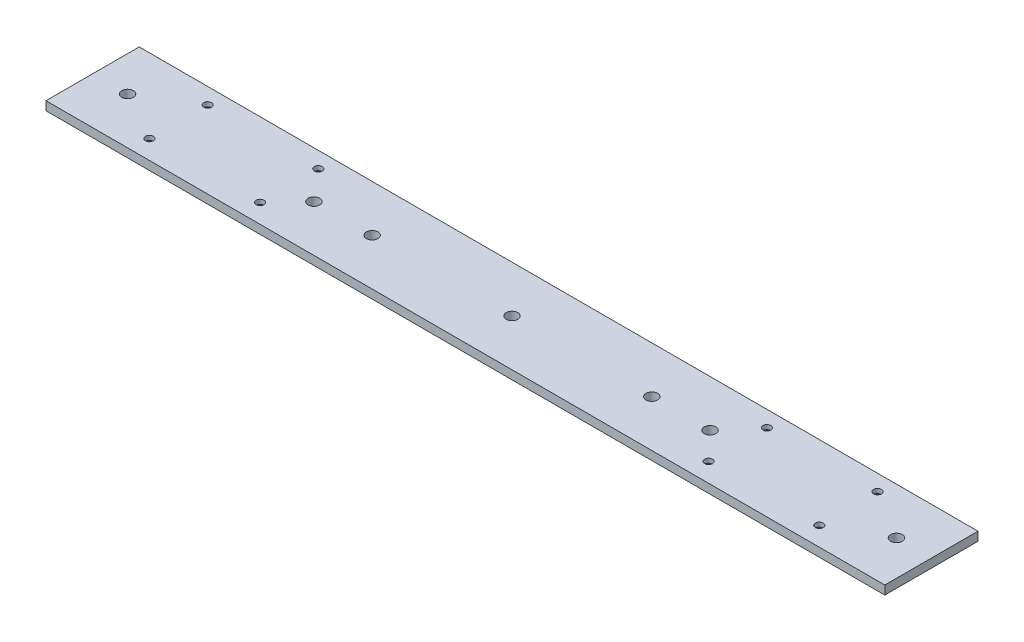
ISO-10303-21;
HEADER;
FILE_DESCRIPTION(('STEP AP214'),'2;1');
FILE_NAME('part.step','',(''),(''),'','','');
FILE_SCHEMA(('AUTOMOTIVE_DESIGN { 1 0 10303 214 1 1 1 1 }'));
ENDSEC;
DATA;
#1=APPLICATION_CONTEXT('core data for automotive mechanical design processes');
#2=APPLICATION_PROTOCOL_DEFINITION('international standard','automotive_design',2000,#1);
#3=PRODUCT_CONTEXT('',#1,'mechanical');
#4=PRODUCT('Part','Part','',(#3));
#5=PRODUCT_RELATED_PRODUCT_CATEGORY('part','',(#4));
#6=PRODUCT_DEFINITION_FORMATION('','',#4);
#7=PRODUCT_DEFINITION_CONTEXT('part definition',#1,'design');
#8=PRODUCT_DEFINITION('design','',#6,#7);
#9=PRODUCT_DEFINITION_SHAPE('','',#8);
#10=(LENGTH_UNIT() NAMED_UNIT(*) SI_UNIT(.MILLI.,.METRE.));
#11=(NAMED_UNIT(*) PLANE_ANGLE_UNIT() SI_UNIT($,.RADIAN.));
#12=(NAMED_UNIT(*) SI_UNIT($,.STERADIAN.) SOLID_ANGLE_UNIT());
#13=UNCERTAINTY_MEASURE_WITH_UNIT(LENGTH_MEASURE(1.E-05),#10,'distance_accuracy_value','');
#14=(GEOMETRIC_REPRESENTATION_CONTEXT(3) GLOBAL_UNCERTAINTY_ASSIGNED_CONTEXT((#13)) GLOBAL_UNIT_ASSIGNED_CONTEXT((#10,
#11,#12)) REPRESENTATION_CONTEXT('',''));
#15=CARTESIAN_POINT('',(0.,0.,0.));
#16=DIRECTION('',(0.,0.,1.));
#17=DIRECTION('',(1.,0.,0.));
#18=AXIS2_PLACEMENT_3D('',#15,#16,#17);
#19=CARTESIAN_POINT('',(0.,4.7625,0.));
#20=DIRECTION('',(1.,0.,0.));
#21=DIRECTION('',(0.,0.,-1.));
#22=AXIS2_PLACEMENT_3D('',#19,#20,#21);
#23=PLANE('',#22);
#24=DIRECTION('',(0.,0.,1.));
#25=VECTOR('',#24,1.);
#26=CARTESIAN_POINT('',(0.,0.,0.));
#27=LINE('',#26,#25);
#28=CARTESIAN_POINT('',(0.,0.,-50.8));
#29=VERTEX_POINT('',#28);
#30=CARTESIAN_POINT('',(0.,0.,0.));
#31=VERTEX_POINT('',#30);
#32=EDGE_CURVE('E101',#29,#31,#27,.T.);
#33=ORIENTED_EDGE('',*,*,#32,.T.);
#34=DIRECTION('',(0.,-1.,0.));
#35=VECTOR('',#34,1.);
#36=CARTESIAN_POINT('',(0.,4.7625,0.));
#37=LINE('',#36,#35);
#38=CARTESIAN_POINT('',(0.,4.7625,0.));
#39=VERTEX_POINT('',#38);
#40=EDGE_CURVE('E11',#39,#31,#37,.T.);
#41=ORIENTED_EDGE('',*,*,#40,.F.);
#42=DIRECTION('',(0.,0.,1.));
#43=VECTOR('',#42,1.);
#44=CARTESIAN_POINT('',(0.,4.7625,0.));
#45=LINE('',#44,#43);
#46=CARTESIAN_POINT('',(0.,4.7625,-50.8));
#47=VERTEX_POINT('',#46);
#48=EDGE_CURVE('E87',#47,#39,#45,.T.);
#49=ORIENTED_EDGE('',*,*,#48,.F.);
#50=DIRECTION('',(0.,-1.,0.));
#51=VECTOR('',#50,1.);
#52=CARTESIAN_POINT('',(0.,4.7625,-50.8));
#53=LINE('',#52,#51);
#54=EDGE_CURVE('E97',#47,#29,#53,.T.);
#55=ORIENTED_EDGE('',*,*,#54,.T.);
#56=EDGE_LOOP('',(#33,#41,#49,#55));
#57=FACE_BOUND('',#56,.T.);
#58=ADVANCED_FACE('F34',(#57),#23,.F.);
#59=CARTESIAN_POINT('',(0.,4.7625,0.));
#60=DIRECTION('',(0.,0.,-1.));
#61=DIRECTION('',(-1.,0.,0.));
#62=AXIS2_PLACEMENT_3D('',#59,#60,#61);
#63=PLANE('',#62);
#64=DIRECTION('',(1.,0.,0.));
#65=VECTOR('',#64,1.);
#66=CARTESIAN_POINT('',(0.,0.,0.));
#67=LINE('',#66,#65);
#68=CARTESIAN_POINT('',(457.2,0.,0.));
#69=VERTEX_POINT('',#68);
#70=EDGE_CURVE('E91',#31,#69,#67,.T.);
#71=ORIENTED_EDGE('',*,*,#70,.T.);
#72=DIRECTION('',(0.,-1.,0.));
#73=VECTOR('',#72,1.);
#74=CARTESIAN_POINT('',(457.2,4.7625,0.));
#75=LINE('',#74,#73);
#76=CARTESIAN_POINT('',(457.2,4.7625,0.));
#77=VERTEX_POINT('',#76);
#78=EDGE_CURVE('E43',#77,#69,#75,.T.);
#79=ORIENTED_EDGE('',*,*,#78,.F.);
#80=DIRECTION('',(1.,0.,0.));
#81=VECTOR('',#80,1.);
#82=CARTESIAN_POINT('',(0.,4.7625,0.));
#83=LINE('',#82,#81);
#84=EDGE_CURVE('E82',#39,#77,#83,.T.);
#85=ORIENTED_EDGE('',*,*,#84,.F.);
#86=ORIENTED_EDGE('',*,*,#40,.T.);
#87=EDGE_LOOP('',(#71,#79,#85,#86));
#88=FACE_BOUND('',#87,.T.);
#89=ADVANCED_FACE('F90',(#88),#63,.F.);
#90=CARTESIAN_POINT('',(457.2,4.7625,0.));
#91=DIRECTION('',(-1.,0.,0.));
#92=DIRECTION('',(0.,0.,1.));
#93=AXIS2_PLACEMENT_3D('',#90,#91,#92);
#94=PLANE('',#93);
#95=DIRECTION('',(0.,0.,-1.));
#96=VECTOR('',#95,1.);
#97=CARTESIAN_POINT('',(457.2,0.,0.));
#98=LINE('',#97,#96);
#99=CARTESIAN_POINT('',(457.2,0.,-50.8));
#100=VERTEX_POINT('',#99);
#101=EDGE_CURVE('E69',#69,#100,#98,.T.);
#102=ORIENTED_EDGE('',*,*,#101,.T.);
#103=DIRECTION('',(0.,-1.,0.));
#104=VECTOR('',#103,1.);
#105=CARTESIAN_POINT('',(457.2,4.7625,-50.8));
#106=LINE('',#105,#104);
#107=CARTESIAN_POINT('',(457.2,4.7625,-50.8));
#108=VERTEX_POINT('',#107);
#109=EDGE_CURVE('E92',#108,#100,#106,.T.);
#110=ORIENTED_EDGE('',*,*,#109,.F.);
#111=DIRECTION('',(0.,0.,-1.));
#112=VECTOR('',#111,1.);
#113=CARTESIAN_POINT('',(457.2,4.7625,0.));
#114=LINE('',#113,#112);
#115=EDGE_CURVE('E85',#77,#108,#114,.T.);
#116=ORIENTED_EDGE('',*,*,#115,.F.);
#117=ORIENTED_EDGE('',*,*,#78,.T.);
#118=EDGE_LOOP('',(#102,#110,#116,#117));
#119=FACE_BOUND('',#118,.T.);
#120=ADVANCED_FACE('F94',(#119),#94,.F.);
#121=CARTESIAN_POINT('',(0.,4.7625,-50.8));
#122=DIRECTION('',(0.,0.,1.));
#123=DIRECTION('',(1.,0.,0.));
#124=AXIS2_PLACEMENT_3D('',#121,#122,#123);
#125=PLANE('',#124);
#126=DIRECTION('',(-1.,0.,0.));
#127=VECTOR('',#126,1.);
#128=CARTESIAN_POINT('',(0.,0.,-50.8));
#129=LINE('',#128,#127);
#130=EDGE_CURVE('E75',#100,#29,#129,.T.);
#131=ORIENTED_EDGE('',*,*,#130,.T.);
#132=ORIENTED_EDGE('',*,*,#54,.F.);
#133=DIRECTION('',(-1.,0.,0.));
#134=VECTOR('',#133,1.);
#135=CARTESIAN_POINT('',(0.,4.7625,-50.8));
#136=LINE('',#135,#134);
#137=EDGE_CURVE('E52',#108,#47,#136,.T.);
#138=ORIENTED_EDGE('',*,*,#137,.F.);
#139=ORIENTED_EDGE('',*,*,#109,.T.);
#140=EDGE_LOOP('',(#131,#132,#138,#139));
#141=FACE_BOUND('',#140,.T.);
#142=ADVANCED_FACE('F162',(#141),#125,.F.);
#143=CARTESIAN_POINT('',(0.,4.7625,0.));
#144=DIRECTION('',(0.,-1.,0.));
#145=DIRECTION('',(0.,0.,-1.));
#146=AXIS2_PLACEMENT_3D('',#143,#144,#145);
#147=PLANE('',#146);
#148=CARTESIAN_POINT('',(46.0375,4.7625,-42.06875));
#149=DIRECTION('',(0.,-1.,0.));
#150=DIRECTION('',(0.,0.,-1.));
#151=AXIS2_PLACEMENT_3D('',#148,#149,#150);
#152=CIRCLE('',#151,2.15265);
#153=CARTESIAN_POINT('',(46.0375,4.7625,-44.2214));
#154=VERTEX_POINT('',#153);
#155=EDGE_CURVE('E441',#154,#154,#152,.T.);
#156=ORIENTED_EDGE('',*,*,#155,.T.);
#157=EDGE_LOOP('',(#156));
#158=FACE_BOUND('',#157,.T.);
#159=CARTESIAN_POINT('',(46.0375,4.7625,-10.31875));
#160=DIRECTION('',(0.,-1.,0.));
#161=DIRECTION('',(0.,0.,-1.));
#162=AXIS2_PLACEMENT_3D('',#159,#160,#161);
#163=CIRCLE('',#162,2.15265);
#164=CARTESIAN_POINT('',(46.0375,4.7625,-12.4714));
#165=VERTEX_POINT('',#164);
#166=EDGE_CURVE('E451',#165,#165,#163,.T.);
#167=ORIENTED_EDGE('',*,*,#166,.T.);
#168=EDGE_LOOP('',(#167));
#169=FACE_BOUND('',#168,.T.);
#170=CARTESIAN_POINT('',(106.3625,4.7625,-10.31875));
#171=DIRECTION('',(0.,-1.,0.));
#172=DIRECTION('',(0.,0.,-1.));
#173=AXIS2_PLACEMENT_3D('',#170,#171,#172);
#174=CIRCLE('',#173,2.15265000000001);
#175=CARTESIAN_POINT('',(106.3625,4.7625,-12.4714));
#176=VERTEX_POINT('',#175);
#177=EDGE_CURVE('E460',#176,#176,#174,.T.);
#178=ORIENTED_EDGE('',*,*,#177,.T.);
#179=EDGE_LOOP('',(#178));
#180=FACE_BOUND('',#179,.T.);
#181=CARTESIAN_POINT('',(106.3625,4.7625,-42.06875));
#182=DIRECTION('',(0.,-1.,0.));
#183=DIRECTION('',(0.,0.,-1.));
#184=AXIS2_PLACEMENT_3D('',#181,#182,#183);
#185=CIRCLE('',#184,2.15264999999999);
#186=CARTESIAN_POINT('',(106.3625,4.7625,-44.2214));
#187=VERTEX_POINT('',#186);
#188=EDGE_CURVE('E469',#187,#187,#185,.T.);
#189=ORIENTED_EDGE('',*,*,#188,.T.);
#190=EDGE_LOOP('',(#189));
#191=FACE_BOUND('',#190,.T.);
#192=CARTESIAN_POINT('',(350.8375,4.7625,-42.06875));
#193=DIRECTION('',(0.,-1.,0.));
#194=DIRECTION('',(0.,0.,-1.));
#195=AXIS2_PLACEMENT_3D('',#192,#193,#194);
#196=CIRCLE('',#195,2.15264999999998);
#197=CARTESIAN_POINT('',(350.8375,4.7625,-44.2214));
#198=VERTEX_POINT('',#197);
#199=EDGE_CURVE('E478',#198,#198,#196,.T.);
#200=ORIENTED_EDGE('',*,*,#199,.T.);
#201=EDGE_LOOP('',(#200));
#202=FACE_BOUND('',#201,.T.);
#203=CARTESIAN_POINT('',(350.8375,4.7625,-10.31875));
#204=DIRECTION('',(0.,-1.,0.));
#205=DIRECTION('',(0.,0.,-1.));
#206=AXIS2_PLACEMENT_3D('',#203,#204,#205);
#207=CIRCLE('',#206,2.15264999999998);
#208=CARTESIAN_POINT('',(350.8375,4.7625,-12.4714));
#209=VERTEX_POINT('',#208);
#210=EDGE_CURVE('E487',#209,#209,#207,.T.);
#211=ORIENTED_EDGE('',*,*,#210,.T.);
#212=EDGE_LOOP('',(#211));
#213=FACE_BOUND('',#212,.T.);
#214=CARTESIAN_POINT('',(411.1625,4.7625,-10.31875));
#215=DIRECTION('',(0.,-1.,0.));
#216=DIRECTION('',(0.,0.,-1.));
#217=AXIS2_PLACEMENT_3D('',#214,#215,#216);
#218=CIRCLE('',#217,2.15264999999998);
#219=CARTESIAN_POINT('',(411.1625,4.7625,-12.4714));
#220=VERTEX_POINT('',#219);
#221=EDGE_CURVE('E496',#220,#220,#218,.T.);
#222=ORIENTED_EDGE('',*,*,#221,.T.);
#223=EDGE_LOOP('',(#222));
#224=FACE_BOUND('',#223,.T.);
#225=CARTESIAN_POINT('',(411.1625,4.7625,-42.06875));
#226=DIRECTION('',(0.,-1.,0.));
#227=DIRECTION('',(0.,0.,-1.));
#228=AXIS2_PLACEMENT_3D('',#225,#226,#227);
#229=CIRCLE('',#228,2.15264999999998);
#230=CARTESIAN_POINT('',(411.1625,4.7625,-44.2214));
#231=VERTEX_POINT('',#230);
#232=EDGE_CURVE('E506',#231,#231,#229,.T.);
#233=ORIENTED_EDGE('',*,*,#232,.T.);
#234=EDGE_LOOP('',(#233));
#235=FACE_BOUND('',#234,.T.);
#236=CARTESIAN_POINT('',(336.55,4.7625,-25.4));
#237=DIRECTION('',(0.,1.,0.));
#238=DIRECTION('',(0.,0.,1.));
#239=AXIS2_PLACEMENT_3D('',#236,#237,#238);
#240=CIRCLE('',#239,3.17499999999997);
#241=CARTESIAN_POINT('',(336.55,4.7625,-22.225));
#242=VERTEX_POINT('',#241);
#243=EDGE_CURVE('E144',#242,#242,#240,.T.);
#244=ORIENTED_EDGE('',*,*,#243,.F.);
#245=EDGE_LOOP('',(#244));
#246=FACE_BOUND('',#245,.T.);
#247=CARTESIAN_POINT('',(120.65,4.7625,-25.4));
#248=DIRECTION('',(0.,1.,0.));
#249=DIRECTION('',(0.,0.,1.));
#250=AXIS2_PLACEMENT_3D('',#247,#248,#249);
#251=CIRCLE('',#250,3.175);
#252=CARTESIAN_POINT('',(120.65,4.7625,-22.225));
#253=VERTEX_POINT('',#252);
#254=EDGE_CURVE('E134',#253,#253,#251,.T.);
#255=ORIENTED_EDGE('',*,*,#254,.F.);
#256=EDGE_LOOP('',(#255));
#257=FACE_BOUND('',#256,.T.);
#258=CARTESIAN_POINT('',(228.6,4.7625,-25.4));
#259=DIRECTION('',(0.,1.,0.));
#260=DIRECTION('',(0.,0.,1.));
#261=AXIS2_PLACEMENT_3D('',#258,#259,#260);
#262=CIRCLE('',#261,3.175);
#263=CARTESIAN_POINT('',(228.6,4.7625,-22.225));
#264=VERTEX_POINT('',#263);
#265=EDGE_CURVE('E131',#264,#264,#262,.T.);
#266=ORIENTED_EDGE('',*,*,#265,.F.);
#267=EDGE_LOOP('',(#266));
#268=FACE_BOUND('',#267,.T.);
#269=CARTESIAN_POINT('',(304.8,4.7625,-25.4));
#270=DIRECTION('',(0.,1.,0.));
#271=DIRECTION('',(0.,0.,1.));
#272=AXIS2_PLACEMENT_3D('',#269,#270,#271);
#273=CIRCLE('',#272,3.17499999999997);
#274=CARTESIAN_POINT('',(304.8,4.7625,-22.225));
#275=VERTEX_POINT('',#274);
#276=EDGE_CURVE('E127',#275,#275,#273,.T.);
#277=ORIENTED_EDGE('',*,*,#276,.F.);
#278=EDGE_LOOP('',(#277));
#279=FACE_BOUND('',#278,.T.);
#280=CARTESIAN_POINT('',(152.4,4.7625,-25.4));
#281=DIRECTION('',(0.,1.,0.));
#282=DIRECTION('',(0.,0.,1.));
#283=AXIS2_PLACEMENT_3D('',#280,#281,#282);
#284=CIRCLE('',#283,3.17499999999997);
#285=CARTESIAN_POINT('',(152.4,4.7625,-22.225));
#286=VERTEX_POINT('',#285);
#287=EDGE_CURVE('E123',#286,#286,#284,.T.);
#288=ORIENTED_EDGE('',*,*,#287,.F.);
#289=EDGE_LOOP('',(#288));
#290=FACE_BOUND('',#289,.T.);
#291=CARTESIAN_POINT('',(438.15,4.7625,-25.4));
#292=DIRECTION('',(0.,1.,0.));
#293=DIRECTION('',(0.,0.,1.));
#294=AXIS2_PLACEMENT_3D('',#291,#292,#293);
#295=CIRCLE('',#294,3.17499999999997);
#296=CARTESIAN_POINT('',(438.15,4.7625,-22.225));
#297=VERTEX_POINT('',#296);
#298=EDGE_CURVE('E118',#297,#297,#295,.T.);
#299=ORIENTED_EDGE('',*,*,#298,.F.);
#300=EDGE_LOOP('',(#299));
#301=FACE_BOUND('',#300,.T.);
#302=CARTESIAN_POINT('',(19.05,4.7625,-25.4));
#303=DIRECTION('',(0.,1.,0.));
#304=DIRECTION('',(0.,0.,1.));
#305=AXIS2_PLACEMENT_3D('',#302,#303,#304);
#306=CIRCLE('',#305,3.175);
#307=CARTESIAN_POINT('',(19.05,4.7625,-22.225));
#308=VERTEX_POINT('',#307);
#309=EDGE_CURVE('E114',#308,#308,#306,.T.);
#310=ORIENTED_EDGE('',*,*,#309,.F.);
#311=EDGE_LOOP('',(#310));
#312=FACE_BOUND('',#311,.T.);
#313=ORIENTED_EDGE('',*,*,#48,.T.);
#314=ORIENTED_EDGE('',*,*,#84,.T.);
#315=ORIENTED_EDGE('',*,*,#115,.T.);
#316=ORIENTED_EDGE('',*,*,#137,.T.);
#317=EDGE_LOOP('',(#313,#314,#315,#316));
#318=FACE_BOUND('',#317,.T.);
#319=ADVANCED_FACE('F83',(#158,#169,#180,#191,#202,#213,#224,#235,#246,#257,#268,#279,#290,#301,
#312,#318),#147,.F.);
#320=CARTESIAN_POINT('',(0.,0.,0.));
#321=DIRECTION('',(0.,-1.,0.));
#322=DIRECTION('',(0.,0.,-1.));
#323=AXIS2_PLACEMENT_3D('',#320,#321,#322);
#324=PLANE('',#323);
#325=CARTESIAN_POINT('',(46.0375,0.,-42.06875));
#326=DIRECTION('',(0.,-1.,0.));
#327=DIRECTION('',(0.,0.,-1.));
#328=AXIS2_PLACEMENT_3D('',#325,#326,#327);
#329=CIRCLE('',#328,4.2164);
#330=CARTESIAN_POINT('',(46.0375,0.,-46.28515));
#331=VERTEX_POINT('',#330);
#332=EDGE_CURVE('E439',#331,#331,#329,.T.);
#333=ORIENTED_EDGE('',*,*,#332,.F.);
#334=EDGE_LOOP('',(#333));
#335=FACE_BOUND('',#334,.T.);
#336=CARTESIAN_POINT('',(46.0375,0.,-10.31875));
#337=DIRECTION('',(0.,-1.,0.));
#338=DIRECTION('',(0.,0.,-1.));
#339=AXIS2_PLACEMENT_3D('',#336,#337,#338);
#340=CIRCLE('',#339,4.2164);
#341=CARTESIAN_POINT('',(46.0375,0.,-14.53515));
#342=VERTEX_POINT('',#341);
#343=EDGE_CURVE('E445',#342,#342,#340,.T.);
#344=ORIENTED_EDGE('',*,*,#343,.F.);
#345=EDGE_LOOP('',(#344));
#346=FACE_BOUND('',#345,.T.);
#347=CARTESIAN_POINT('',(106.3625,0.,-10.31875));
#348=DIRECTION('',(0.,-1.,0.));
#349=DIRECTION('',(0.,0.,-1.));
#350=AXIS2_PLACEMENT_3D('',#347,#348,#349);
#351=CIRCLE('',#350,4.21639999999999);
#352=CARTESIAN_POINT('',(106.3625,0.,-14.53515));
#353=VERTEX_POINT('',#352);
#354=EDGE_CURVE('E454',#353,#353,#351,.T.);
#355=ORIENTED_EDGE('',*,*,#354,.F.);
#356=EDGE_LOOP('',(#355));
#357=FACE_BOUND('',#356,.T.);
#358=CARTESIAN_POINT('',(106.3625,0.,-42.06875));
#359=DIRECTION('',(0.,-1.,0.));
#360=DIRECTION('',(0.,0.,-1.));
#361=AXIS2_PLACEMENT_3D('',#358,#359,#360);
#362=CIRCLE('',#361,4.21639999999999);
#363=CARTESIAN_POINT('',(106.3625,0.,-46.28515));
#364=VERTEX_POINT('',#363);
#365=EDGE_CURVE('E463',#364,#364,#362,.T.);
#366=ORIENTED_EDGE('',*,*,#365,.F.);
#367=EDGE_LOOP('',(#366));
#368=FACE_BOUND('',#367,.T.);
#369=CARTESIAN_POINT('',(350.8375,0.,-42.06875));
#370=DIRECTION('',(0.,-1.,0.));
#371=DIRECTION('',(0.,0.,-1.));
#372=AXIS2_PLACEMENT_3D('',#369,#370,#371);
#373=CIRCLE('',#372,4.21640000000001);
#374=CARTESIAN_POINT('',(350.8375,0.,-46.28515));
#375=VERTEX_POINT('',#374);
#376=EDGE_CURVE('E472',#375,#375,#373,.T.);
#377=ORIENTED_EDGE('',*,*,#376,.F.);
#378=EDGE_LOOP('',(#377));
#379=FACE_BOUND('',#378,.T.);
#380=CARTESIAN_POINT('',(350.8375,0.,-10.31875));
#381=DIRECTION('',(0.,-1.,0.));
#382=DIRECTION('',(0.,0.,-1.));
#383=AXIS2_PLACEMENT_3D('',#380,#381,#382);
#384=CIRCLE('',#383,4.21640000000001);
#385=CARTESIAN_POINT('',(350.8375,0.,-14.53515));
#386=VERTEX_POINT('',#385);
#387=EDGE_CURVE('E481',#386,#386,#384,.T.);
#388=ORIENTED_EDGE('',*,*,#387,.F.);
#389=EDGE_LOOP('',(#388));
#390=FACE_BOUND('',#389,.T.);
#391=CARTESIAN_POINT('',(411.1625,0.,-10.31875));
#392=DIRECTION('',(0.,-1.,0.));
#393=DIRECTION('',(0.,0.,-1.));
#394=AXIS2_PLACEMENT_3D('',#391,#392,#393);
#395=CIRCLE('',#394,4.21640000000001);
#396=CARTESIAN_POINT('',(411.1625,0.,-14.53515));
#397=VERTEX_POINT('',#396);
#398=EDGE_CURVE('E490',#397,#397,#395,.T.);
#399=ORIENTED_EDGE('',*,*,#398,.F.);
#400=EDGE_LOOP('',(#399));
#401=FACE_BOUND('',#400,.T.);
#402=CARTESIAN_POINT('',(411.1625,0.,-42.06875));
#403=DIRECTION('',(0.,-1.,0.));
#404=DIRECTION('',(0.,0.,-1.));
#405=AXIS2_PLACEMENT_3D('',#402,#403,#404);
#406=CIRCLE('',#405,4.21640000000001);
#407=CARTESIAN_POINT('',(411.1625,0.,-46.28515));
#408=VERTEX_POINT('',#407);
#409=EDGE_CURVE('E499',#408,#408,#406,.T.);
#410=ORIENTED_EDGE('',*,*,#409,.F.);
#411=EDGE_LOOP('',(#410));
#412=FACE_BOUND('',#411,.T.);
#413=CARTESIAN_POINT('',(336.55,0.,-25.4));
#414=DIRECTION('',(0.,-1.,0.));
#415=DIRECTION('',(0.,0.,-1.));
#416=AXIS2_PLACEMENT_3D('',#413,#414,#415);
#417=CIRCLE('',#416,3.17499999999997);
#418=CARTESIAN_POINT('',(336.55,0.,-28.575));
#419=VERTEX_POINT('',#418);
#420=EDGE_CURVE('E37',#419,#419,#417,.T.);
#421=ORIENTED_EDGE('',*,*,#420,.F.);
#422=EDGE_LOOP('',(#421));
#423=FACE_BOUND('',#422,.T.);
#424=CARTESIAN_POINT('',(120.65,0.,-25.4));
#425=DIRECTION('',(0.,-1.,0.));
#426=DIRECTION('',(0.,0.,-1.));
#427=AXIS2_PLACEMENT_3D('',#424,#425,#426);
#428=CIRCLE('',#427,3.175);
#429=CARTESIAN_POINT('',(120.65,0.,-28.575));
#430=VERTEX_POINT('',#429);
#431=EDGE_CURVE('E132',#430,#430,#428,.T.);
#432=ORIENTED_EDGE('',*,*,#431,.F.);
#433=EDGE_LOOP('',(#432));
#434=FACE_BOUND('',#433,.T.);
#435=CARTESIAN_POINT('',(228.6,0.,-25.4));
#436=DIRECTION('',(0.,-1.,0.));
#437=DIRECTION('',(0.,0.,-1.));
#438=AXIS2_PLACEMENT_3D('',#435,#436,#437);
#439=CIRCLE('',#438,3.175);
#440=CARTESIAN_POINT('',(228.6,0.,-28.575));
#441=VERTEX_POINT('',#440);
#442=EDGE_CURVE('E128',#441,#441,#439,.T.);
#443=ORIENTED_EDGE('',*,*,#442,.F.);
#444=EDGE_LOOP('',(#443));
#445=FACE_BOUND('',#444,.T.);
#446=CARTESIAN_POINT('',(304.8,0.,-25.4));
#447=DIRECTION('',(0.,-1.,0.));
#448=DIRECTION('',(0.,0.,-1.));
#449=AXIS2_PLACEMENT_3D('',#446,#447,#448);
#450=CIRCLE('',#449,3.17499999999997);
#451=CARTESIAN_POINT('',(304.8,0.,-28.575));
#452=VERTEX_POINT('',#451);
#453=EDGE_CURVE('E124',#452,#452,#450,.T.);
#454=ORIENTED_EDGE('',*,*,#453,.F.);
#455=EDGE_LOOP('',(#454));
#456=FACE_BOUND('',#455,.T.);
#457=CARTESIAN_POINT('',(152.4,0.,-25.4));
#458=DIRECTION('',(0.,-1.,0.));
#459=DIRECTION('',(0.,0.,-1.));
#460=AXIS2_PLACEMENT_3D('',#457,#458,#459);
#461=CIRCLE('',#460,3.17499999999997);
#462=CARTESIAN_POINT('',(152.4,0.,-28.575));
#463=VERTEX_POINT('',#462);
#464=EDGE_CURVE('E119',#463,#463,#461,.T.);
#465=ORIENTED_EDGE('',*,*,#464,.F.);
#466=EDGE_LOOP('',(#465));
#467=FACE_BOUND('',#466,.T.);
#468=CARTESIAN_POINT('',(438.15,0.,-25.4));
#469=DIRECTION('',(0.,-1.,0.));
#470=DIRECTION('',(0.,0.,-1.));
#471=AXIS2_PLACEMENT_3D('',#468,#469,#470);
#472=CIRCLE('',#471,3.17499999999997);
#473=CARTESIAN_POINT('',(438.15,0.,-28.575));
#474=VERTEX_POINT('',#473);
#475=EDGE_CURVE('E115',#474,#474,#472,.T.);
#476=ORIENTED_EDGE('',*,*,#475,.F.);
#477=EDGE_LOOP('',(#476));
#478=FACE_BOUND('',#477,.T.);
#479=CARTESIAN_POINT('',(19.05,0.,-25.4));
#480=DIRECTION('',(0.,-1.,0.));
#481=DIRECTION('',(0.,0.,-1.));
#482=AXIS2_PLACEMENT_3D('',#479,#480,#481);
#483=CIRCLE('',#482,3.175);
#484=CARTESIAN_POINT('',(19.05,0.,-28.575));
#485=VERTEX_POINT('',#484);
#486=EDGE_CURVE('E104',#485,#485,#483,.T.);
#487=ORIENTED_EDGE('',*,*,#486,.F.);
#488=EDGE_LOOP('',(#487));
#489=FACE_BOUND('',#488,.T.);
#490=ORIENTED_EDGE('',*,*,#32,.F.);
#491=ORIENTED_EDGE('',*,*,#130,.F.);
#492=ORIENTED_EDGE('',*,*,#101,.F.);
#493=ORIENTED_EDGE('',*,*,#70,.F.);
#494=EDGE_LOOP('',(#490,#491,#492,#493));
#495=FACE_BOUND('',#494,.T.);
#496=ADVANCED_FACE('F161',(#335,#346,#357,#368,#379,#390,#401,#412,#423,#434,#445,#456,#467,
#478,#489,#495),#324,.T.);
#497=CARTESIAN_POINT('',(19.05,-239.8395,-25.4));
#498=DIRECTION('',(0.,1.,0.));
#499=DIRECTION('',(0.,0.,1.));
#500=AXIS2_PLACEMENT_3D('',#497,#498,#499);
#501=CYLINDRICAL_SURFACE('',#500,3.175);
#502=ORIENTED_EDGE('',*,*,#486,.T.);
#503=EDGE_LOOP('',(#502));
#504=FACE_BOUND('',#503,.T.);
#505=ORIENTED_EDGE('',*,*,#309,.T.);
#506=EDGE_LOOP('',(#505));
#507=FACE_BOUND('',#506,.T.);
#508=ADVANCED_FACE('F158',(#504,#507),#501,.F.);
#509=CARTESIAN_POINT('',(438.15,-239.8395,-25.4));
#510=DIRECTION('',(0.,1.,0.));
#511=DIRECTION('',(0.,0.,1.));
#512=AXIS2_PLACEMENT_3D('',#509,#510,#511);
#513=CYLINDRICAL_SURFACE('',#512,3.17499999999997);
#514=ORIENTED_EDGE('',*,*,#475,.T.);
#515=EDGE_LOOP('',(#514));
#516=FACE_BOUND('',#515,.T.);
#517=ORIENTED_EDGE('',*,*,#298,.T.);
#518=EDGE_LOOP('',(#517));
#519=FACE_BOUND('',#518,.T.);
#520=ADVANCED_FACE('F202',(#516,#519),#513,.F.);
#521=CARTESIAN_POINT('',(152.4,-239.8395,-25.4));
#522=DIRECTION('',(0.,1.,0.));
#523=DIRECTION('',(0.,0.,1.));
#524=AXIS2_PLACEMENT_3D('',#521,#522,#523);
#525=CYLINDRICAL_SURFACE('',#524,3.17499999999997);
#526=ORIENTED_EDGE('',*,*,#464,.T.);
#527=EDGE_LOOP('',(#526));
#528=FACE_BOUND('',#527,.T.);
#529=ORIENTED_EDGE('',*,*,#287,.T.);
#530=EDGE_LOOP('',(#529));
#531=FACE_BOUND('',#530,.T.);
#532=ADVANCED_FACE('F212',(#528,#531),#525,.F.);
#533=CARTESIAN_POINT('',(304.8,-239.8395,-25.4));
#534=DIRECTION('',(0.,1.,0.));
#535=DIRECTION('',(0.,0.,1.));
#536=AXIS2_PLACEMENT_3D('',#533,#534,#535);
#537=CYLINDRICAL_SURFACE('',#536,3.17499999999997);
#538=ORIENTED_EDGE('',*,*,#453,.T.);
#539=EDGE_LOOP('',(#538));
#540=FACE_BOUND('',#539,.T.);
#541=ORIENTED_EDGE('',*,*,#276,.T.);
#542=EDGE_LOOP('',(#541));
#543=FACE_BOUND('',#542,.T.);
#544=ADVANCED_FACE('F222',(#540,#543),#537,.F.);
#545=CARTESIAN_POINT('',(228.6,-239.8395,-25.4));
#546=DIRECTION('',(0.,1.,0.));
#547=DIRECTION('',(0.,0.,1.));
#548=AXIS2_PLACEMENT_3D('',#545,#546,#547);
#549=CYLINDRICAL_SURFACE('',#548,3.175);
#550=ORIENTED_EDGE('',*,*,#442,.T.);
#551=EDGE_LOOP('',(#550));
#552=FACE_BOUND('',#551,.T.);
#553=ORIENTED_EDGE('',*,*,#265,.T.);
#554=EDGE_LOOP('',(#553));
#555=FACE_BOUND('',#554,.T.);
#556=ADVANCED_FACE('F232',(#552,#555),#549,.F.);
#557=CARTESIAN_POINT('',(120.65,-20.6375,-25.4));
#558=DIRECTION('',(0.,1.,0.));
#559=DIRECTION('',(0.,0.,1.));
#560=AXIS2_PLACEMENT_3D('',#557,#558,#559);
#561=CYLINDRICAL_SURFACE('',#560,3.175);
#562=ORIENTED_EDGE('',*,*,#431,.T.);
#563=EDGE_LOOP('',(#562));
#564=FACE_BOUND('',#563,.T.);
#565=ORIENTED_EDGE('',*,*,#254,.T.);
#566=EDGE_LOOP('',(#565));
#567=FACE_BOUND('',#566,.T.);
#568=ADVANCED_FACE('F242',(#564,#567),#561,.F.);
#569=CARTESIAN_POINT('',(336.55,-20.6375,-25.4));
#570=DIRECTION('',(0.,1.,0.));
#571=DIRECTION('',(0.,0.,1.));
#572=AXIS2_PLACEMENT_3D('',#569,#570,#571);
#573=CYLINDRICAL_SURFACE('',#572,3.17499999999997);
#574=ORIENTED_EDGE('',*,*,#420,.T.);
#575=EDGE_LOOP('',(#574));
#576=FACE_BOUND('',#575,.T.);
#577=ORIENTED_EDGE('',*,*,#243,.T.);
#578=EDGE_LOOP('',(#577));
#579=FACE_BOUND('',#578,.T.);
#580=ADVANCED_FACE('F252',(#576,#579),#573,.F.);
#581=CARTESIAN_POINT('',(411.1625,0.,-42.06875));
#582=DIRECTION('',(0.,-1.,0.));
#583=DIRECTION('',(0.,0.,-1.));
#584=AXIS2_PLACEMENT_3D('',#581,#582,#583);
#585=CYLINDRICAL_SURFACE('',#584,2.15264999999998);
#586=ORIENTED_EDGE('',*,*,#232,.F.);
#587=EDGE_LOOP('',(#586));
#588=FACE_BOUND('',#587,.T.);
#589=CARTESIAN_POINT('',(411.1625,2.37407280040236,-42.06875));
#590=DIRECTION('',(0.,-1.,0.));
#591=DIRECTION('',(0.,0.,-1.));
#592=AXIS2_PLACEMENT_3D('',#589,#590,#591);
#593=CIRCLE('',#592,2.15264999999998);
#594=CARTESIAN_POINT('',(411.1625,2.37407280040236,-44.2214));
#595=VERTEX_POINT('',#594);
#596=EDGE_CURVE('E503',#595,#595,#593,.T.);
#597=ORIENTED_EDGE('',*,*,#596,.T.);
#598=EDGE_LOOP('',(#597));
#599=FACE_BOUND('',#598,.T.);
#600=ADVANCED_FACE('F260',(#588,#599),#585,.F.);
#601=CARTESIAN_POINT('',(411.1625,0.,-42.06875));
#602=DIRECTION('',(0.,-1.,0.));
#603=DIRECTION('',(0.,0.,-1.));
#604=AXIS2_PLACEMENT_3D('',#601,#602,#603);
#605=CONICAL_SURFACE('',#604,4.21640000000001,0.715584993317682);
#606=ORIENTED_EDGE('',*,*,#596,.F.);
#607=EDGE_LOOP('',(#606));
#608=FACE_BOUND('',#607,.T.);
#609=ORIENTED_EDGE('',*,*,#409,.T.);
#610=EDGE_LOOP('',(#609));
#611=FACE_BOUND('',#610,.T.);
#612=ADVANCED_FACE('F279',(#608,#611),#605,.F.);
#613=CARTESIAN_POINT('',(411.1625,0.,-10.31875));
#614=DIRECTION('',(0.,-1.,0.));
#615=DIRECTION('',(0.,0.,-1.));
#616=AXIS2_PLACEMENT_3D('',#613,#614,#615);
#617=CYLINDRICAL_SURFACE('',#616,2.15264999999998);
#618=ORIENTED_EDGE('',*,*,#221,.F.);
#619=EDGE_LOOP('',(#618));
#620=FACE_BOUND('',#619,.T.);
#621=CARTESIAN_POINT('',(411.1625,2.37407280040236,-10.31875));
#622=DIRECTION('',(0.,-1.,0.));
#623=DIRECTION('',(0.,0.,-1.));
#624=AXIS2_PLACEMENT_3D('',#621,#622,#623);
#625=CIRCLE('',#624,2.15264999999998);
#626=CARTESIAN_POINT('',(411.1625,2.37407280040236,-12.4714));
#627=VERTEX_POINT('',#626);
#628=EDGE_CURVE('E493',#627,#627,#625,.T.);
#629=ORIENTED_EDGE('',*,*,#628,.T.);
#630=EDGE_LOOP('',(#629));
#631=FACE_BOUND('',#630,.T.);
#632=ADVANCED_FACE('F289',(#620,#631),#617,.F.);
#633=CARTESIAN_POINT('',(411.1625,0.,-10.31875));
#634=DIRECTION('',(0.,-1.,0.));
#635=DIRECTION('',(0.,0.,-1.));
#636=AXIS2_PLACEMENT_3D('',#633,#634,#635);
#637=CONICAL_SURFACE('',#636,4.21640000000001,0.715584993317682);
#638=ORIENTED_EDGE('',*,*,#628,.F.);
#639=EDGE_LOOP('',(#638));
#640=FACE_BOUND('',#639,.T.);
#641=ORIENTED_EDGE('',*,*,#398,.T.);
#642=EDGE_LOOP('',(#641));
#643=FACE_BOUND('',#642,.T.);
#644=ADVANCED_FACE('F299',(#640,#643),#637,.F.);
#645=CARTESIAN_POINT('',(350.8375,0.,-10.31875));
#646=DIRECTION('',(0.,-1.,0.));
#647=DIRECTION('',(0.,0.,-1.));
#648=AXIS2_PLACEMENT_3D('',#645,#646,#647);
#649=CYLINDRICAL_SURFACE('',#648,2.15264999999998);
#650=ORIENTED_EDGE('',*,*,#210,.F.);
#651=EDGE_LOOP('',(#650));
#652=FACE_BOUND('',#651,.T.);
#653=CARTESIAN_POINT('',(350.8375,2.37407280040236,-10.31875));
#654=DIRECTION('',(0.,-1.,0.));
#655=DIRECTION('',(0.,0.,-1.));
#656=AXIS2_PLACEMENT_3D('',#653,#654,#655);
#657=CIRCLE('',#656,2.15264999999998);
#658=CARTESIAN_POINT('',(350.8375,2.37407280040236,-12.4714));
#659=VERTEX_POINT('',#658);
#660=EDGE_CURVE('E484',#659,#659,#657,.T.);
#661=ORIENTED_EDGE('',*,*,#660,.T.);
#662=EDGE_LOOP('',(#661));
#663=FACE_BOUND('',#662,.T.);
#664=ADVANCED_FACE('F309',(#652,#663),#649,.F.);
#665=CARTESIAN_POINT('',(350.8375,0.,-10.31875));
#666=DIRECTION('',(0.,-1.,0.));
#667=DIRECTION('',(0.,0.,-1.));
#668=AXIS2_PLACEMENT_3D('',#665,#666,#667);
#669=CONICAL_SURFACE('',#668,4.21640000000001,0.715584993317682);
#670=ORIENTED_EDGE('',*,*,#660,.F.);
#671=EDGE_LOOP('',(#670));
#672=FACE_BOUND('',#671,.T.);
#673=ORIENTED_EDGE('',*,*,#387,.T.);
#674=EDGE_LOOP('',(#673));
#675=FACE_BOUND('',#674,.T.);
#676=ADVANCED_FACE('F319',(#672,#675),#669,.F.);
#677=CARTESIAN_POINT('',(350.8375,0.,-42.06875));
#678=DIRECTION('',(0.,-1.,0.));
#679=DIRECTION('',(0.,0.,-1.));
#680=AXIS2_PLACEMENT_3D('',#677,#678,#679);
#681=CYLINDRICAL_SURFACE('',#680,2.15264999999998);
#682=ORIENTED_EDGE('',*,*,#199,.F.);
#683=EDGE_LOOP('',(#682));
#684=FACE_BOUND('',#683,.T.);
#685=CARTESIAN_POINT('',(350.8375,2.37407280040236,-42.06875));
#686=DIRECTION('',(0.,-1.,0.));
#687=DIRECTION('',(0.,0.,-1.));
#688=AXIS2_PLACEMENT_3D('',#685,#686,#687);
#689=CIRCLE('',#688,2.15264999999998);
#690=CARTESIAN_POINT('',(350.8375,2.37407280040236,-44.2214));
#691=VERTEX_POINT('',#690);
#692=EDGE_CURVE('E475',#691,#691,#689,.T.);
#693=ORIENTED_EDGE('',*,*,#692,.T.);
#694=EDGE_LOOP('',(#693));
#695=FACE_BOUND('',#694,.T.);
#696=ADVANCED_FACE('F329',(#684,#695),#681,.F.);
#697=CARTESIAN_POINT('',(350.8375,0.,-42.06875));
#698=DIRECTION('',(0.,-1.,0.));
#699=DIRECTION('',(0.,0.,-1.));
#700=AXIS2_PLACEMENT_3D('',#697,#698,#699);
#701=CONICAL_SURFACE('',#700,4.21640000000001,0.715584993317682);
#702=ORIENTED_EDGE('',*,*,#692,.F.);
#703=EDGE_LOOP('',(#702));
#704=FACE_BOUND('',#703,.T.);
#705=ORIENTED_EDGE('',*,*,#376,.T.);
#706=EDGE_LOOP('',(#705));
#707=FACE_BOUND('',#706,.T.);
#708=ADVANCED_FACE('F339',(#704,#707),#701,.F.);
#709=CARTESIAN_POINT('',(106.3625,0.,-42.06875));
#710=DIRECTION('',(0.,-1.,0.));
#711=DIRECTION('',(0.,0.,-1.));
#712=AXIS2_PLACEMENT_3D('',#709,#710,#711);
#713=CYLINDRICAL_SURFACE('',#712,2.15265);
#714=ORIENTED_EDGE('',*,*,#188,.F.);
#715=EDGE_LOOP('',(#714));
#716=FACE_BOUND('',#715,.T.);
#717=CARTESIAN_POINT('',(106.3625,2.37407280040236,-42.06875));
#718=DIRECTION('',(0.,-1.,0.));
#719=DIRECTION('',(0.,0.,-1.));
#720=AXIS2_PLACEMENT_3D('',#717,#718,#719);
#721=CIRCLE('',#720,2.15265000000001);
#722=CARTESIAN_POINT('',(106.3625,2.37407280040236,-44.2214));
#723=VERTEX_POINT('',#722);
#724=EDGE_CURVE('E466',#723,#723,#721,.T.);
#725=ORIENTED_EDGE('',*,*,#724,.T.);
#726=EDGE_LOOP('',(#725));
#727=FACE_BOUND('',#726,.T.);
#728=ADVANCED_FACE('F349',(#716,#727),#713,.F.);
#729=CARTESIAN_POINT('',(106.3625,0.,-42.06875));
#730=DIRECTION('',(0.,-1.,0.));
#731=DIRECTION('',(0.,0.,-1.));
#732=AXIS2_PLACEMENT_3D('',#729,#730,#731);
#733=CONICAL_SURFACE('',#732,4.21639999999999,0.715584993317672);
#734=ORIENTED_EDGE('',*,*,#724,.F.);
#735=EDGE_LOOP('',(#734));
#736=FACE_BOUND('',#735,.T.);
#737=ORIENTED_EDGE('',*,*,#365,.T.);
#738=EDGE_LOOP('',(#737));
#739=FACE_BOUND('',#738,.T.);
#740=ADVANCED_FACE('F359',(#736,#739),#733,.F.);
#741=CARTESIAN_POINT('',(106.3625,0.,-10.31875));
#742=DIRECTION('',(0.,-1.,0.));
#743=DIRECTION('',(0.,0.,-1.));
#744=AXIS2_PLACEMENT_3D('',#741,#742,#743);
#745=CYLINDRICAL_SURFACE('',#744,2.15265000000001);
#746=ORIENTED_EDGE('',*,*,#177,.F.);
#747=EDGE_LOOP('',(#746));
#748=FACE_BOUND('',#747,.T.);
#749=CARTESIAN_POINT('',(106.3625,2.37407280040236,-10.31875));
#750=DIRECTION('',(0.,-1.,0.));
#751=DIRECTION('',(0.,0.,-1.));
#752=AXIS2_PLACEMENT_3D('',#749,#750,#751);
#753=CIRCLE('',#752,2.15265000000001);
#754=CARTESIAN_POINT('',(106.3625,2.37407280040236,-12.4714));
#755=VERTEX_POINT('',#754);
#756=EDGE_CURVE('E457',#755,#755,#753,.T.);
#757=ORIENTED_EDGE('',*,*,#756,.T.);
#758=EDGE_LOOP('',(#757));
#759=FACE_BOUND('',#758,.T.);
#760=ADVANCED_FACE('F369',(#748,#759),#745,.F.);
#761=CARTESIAN_POINT('',(106.3625,0.,-10.31875));
#762=DIRECTION('',(0.,-1.,0.));
#763=DIRECTION('',(0.,0.,-1.));
#764=AXIS2_PLACEMENT_3D('',#761,#762,#763);
#765=CONICAL_SURFACE('',#764,4.21639999999999,0.715584993317672);
#766=ORIENTED_EDGE('',*,*,#756,.F.);
#767=EDGE_LOOP('',(#766));
#768=FACE_BOUND('',#767,.T.);
#769=ORIENTED_EDGE('',*,*,#354,.T.);
#770=EDGE_LOOP('',(#769));
#771=FACE_BOUND('',#770,.T.);
#772=ADVANCED_FACE('F379',(#768,#771),#765,.F.);
#773=CARTESIAN_POINT('',(46.0375,0.,-10.31875));
#774=DIRECTION('',(0.,-1.,0.));
#775=DIRECTION('',(0.,0.,-1.));
#776=AXIS2_PLACEMENT_3D('',#773,#774,#775);
#777=CYLINDRICAL_SURFACE('',#776,2.15265);
#778=ORIENTED_EDGE('',*,*,#166,.F.);
#779=EDGE_LOOP('',(#778));
#780=FACE_BOUND('',#779,.T.);
#781=CARTESIAN_POINT('',(46.0375,2.37407280040236,-10.31875));
#782=DIRECTION('',(0.,-1.,0.));
#783=DIRECTION('',(0.,0.,-1.));
#784=AXIS2_PLACEMENT_3D('',#781,#782,#783);
#785=CIRCLE('',#784,2.15265);
#786=CARTESIAN_POINT('',(46.0375,2.37407280040236,-12.4714));
#787=VERTEX_POINT('',#786);
#788=EDGE_CURVE('E448',#787,#787,#785,.T.);
#789=ORIENTED_EDGE('',*,*,#788,.T.);
#790=EDGE_LOOP('',(#789));
#791=FACE_BOUND('',#790,.T.);
#792=ADVANCED_FACE('F389',(#780,#791),#777,.F.);
#793=CARTESIAN_POINT('',(46.0375,0.,-10.31875));
#794=DIRECTION('',(0.,-1.,0.));
#795=DIRECTION('',(0.,0.,-1.));
#796=AXIS2_PLACEMENT_3D('',#793,#794,#795);
#797=CONICAL_SURFACE('',#796,4.2164,0.715584993317675);
#798=ORIENTED_EDGE('',*,*,#788,.F.);
#799=EDGE_LOOP('',(#798));
#800=FACE_BOUND('',#799,.T.);
#801=ORIENTED_EDGE('',*,*,#343,.T.);
#802=EDGE_LOOP('',(#801));
#803=FACE_BOUND('',#802,.T.);
#804=ADVANCED_FACE('F399',(#800,#803),#797,.F.);
#805=CARTESIAN_POINT('',(46.0375,0.,-42.06875));
#806=DIRECTION('',(0.,-1.,0.));
#807=DIRECTION('',(0.,0.,-1.));
#808=AXIS2_PLACEMENT_3D('',#805,#806,#807);
#809=CYLINDRICAL_SURFACE('',#808,2.15265);
#810=ORIENTED_EDGE('',*,*,#155,.F.);
#811=EDGE_LOOP('',(#810));
#812=FACE_BOUND('',#811,.T.);
#813=CARTESIAN_POINT('',(46.0375,2.37407280040236,-42.06875));
#814=DIRECTION('',(0.,-1.,0.));
#815=DIRECTION('',(0.,0.,-1.));
#816=AXIS2_PLACEMENT_3D('',#813,#814,#815);
#817=CIRCLE('',#816,2.15265);
#818=CARTESIAN_POINT('',(46.0375,2.37407280040236,-44.2214));
#819=VERTEX_POINT('',#818);
#820=EDGE_CURVE('E436',#819,#819,#817,.T.);
#821=ORIENTED_EDGE('',*,*,#820,.T.);
#822=EDGE_LOOP('',(#821));
#823=FACE_BOUND('',#822,.T.);
#824=ADVANCED_FACE('F409',(#812,#823),#809,.F.);
#825=CARTESIAN_POINT('',(46.0375,0.,-42.06875));
#826=DIRECTION('',(0.,-1.,0.));
#827=DIRECTION('',(0.,0.,-1.));
#828=AXIS2_PLACEMENT_3D('',#825,#826,#827);
#829=CONICAL_SURFACE('',#828,4.2164,0.715584993317675);
#830=ORIENTED_EDGE('',*,*,#820,.F.);
#831=EDGE_LOOP('',(#830));
#832=FACE_BOUND('',#831,.T.);
#833=ORIENTED_EDGE('',*,*,#332,.T.);
#834=EDGE_LOOP('',(#833));
#835=FACE_BOUND('',#834,.T.);
#836=ADVANCED_FACE('F419',(#832,#835),#829,.F.);
#837=CLOSED_SHELL('',(#58,#89,#120,#142,#319,#496,#508,#520,#532,#544,#556,#568,#580,#600,#612,
#632,#644,#664,#676,#696,#708,#728,#740,#760,#772,#792,#804,#824,#836));
#838=MANIFOLD_SOLID_BREP('B2',#837);
#839=ADVANCED_BREP_SHAPE_REPRESENTATION('',(#18,#838),#14);
#840=SHAPE_DEFINITION_REPRESENTATION(#9,#839);
ENDSEC;
END-ISO-10303-21;
